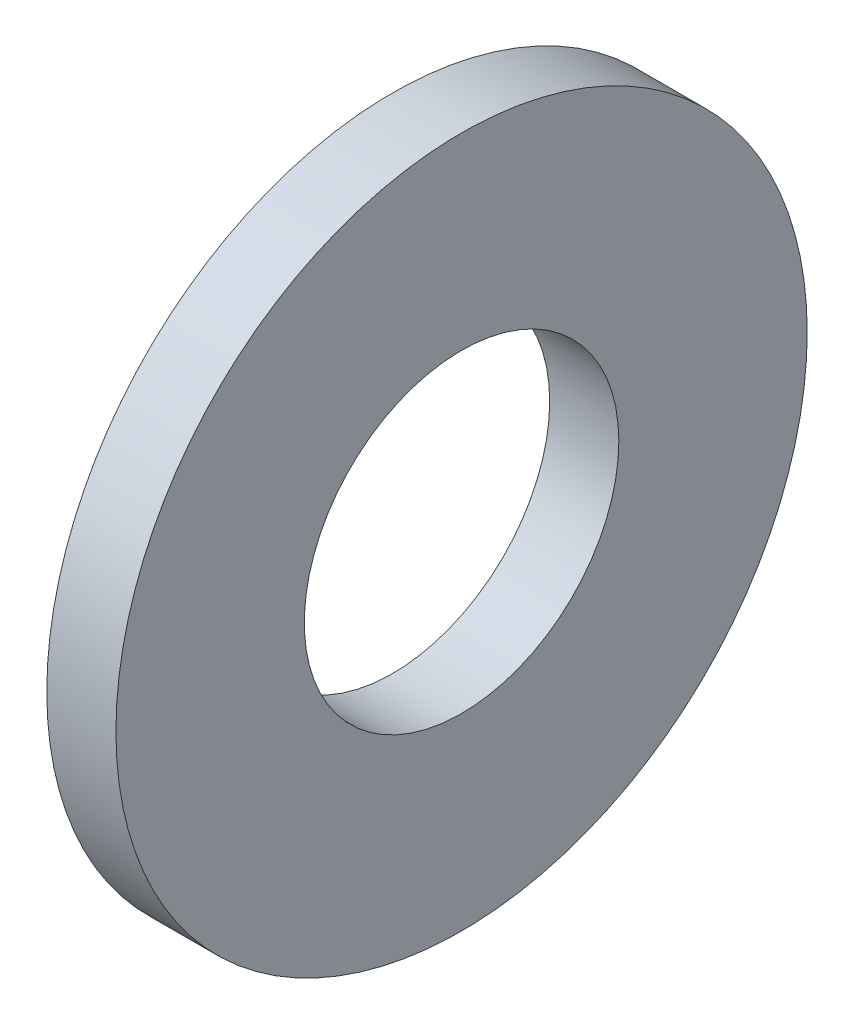
ISO-10303-21;
HEADER;
FILE_DESCRIPTION(('STEP AP214'),'2;1');
FILE_NAME('part.step','',(''),(''),'','','');
FILE_SCHEMA(('AUTOMOTIVE_DESIGN { 1 0 10303 214 1 1 1 1 }'));
ENDSEC;
DATA;
#1=APPLICATION_CONTEXT('core data for automotive mechanical design processes');
#2=APPLICATION_PROTOCOL_DEFINITION('international standard','automotive_design',2000,#1);
#3=PRODUCT_CONTEXT('',#1,'mechanical');
#4=PRODUCT('Part','Part','',(#3));
#5=PRODUCT_RELATED_PRODUCT_CATEGORY('part','',(#4));
#6=PRODUCT_DEFINITION_FORMATION('','',#4);
#7=PRODUCT_DEFINITION_CONTEXT('part definition',#1,'design');
#8=PRODUCT_DEFINITION('design','',#6,#7);
#9=PRODUCT_DEFINITION_SHAPE('','',#8);
#10=(LENGTH_UNIT() NAMED_UNIT(*) SI_UNIT(.MILLI.,.METRE.));
#11=(NAMED_UNIT(*) PLANE_ANGLE_UNIT() SI_UNIT($,.RADIAN.));
#12=(NAMED_UNIT(*) SI_UNIT($,.STERADIAN.) SOLID_ANGLE_UNIT());
#13=UNCERTAINTY_MEASURE_WITH_UNIT(LENGTH_MEASURE(1.E-05),#10,'distance_accuracy_value','');
#14=(GEOMETRIC_REPRESENTATION_CONTEXT(3) GLOBAL_UNCERTAINTY_ASSIGNED_CONTEXT((#13)) GLOBAL_UNIT_ASSIGNED_CONTEXT((#10,
#11,#12)) REPRESENTATION_CONTEXT('',''));
#15=CARTESIAN_POINT('',(0.,0.,0.));
#16=DIRECTION('',(0.,0.,1.));
#17=DIRECTION('',(1.,0.,0.));
#18=AXIS2_PLACEMENT_3D('',#15,#16,#17);
#19=CARTESIAN_POINT('',(1.,0.,0.));
#20=DIRECTION('',(1.,0.,0.));
#21=DIRECTION('',(0.,0.,-1.));
#22=AXIS2_PLACEMENT_3D('',#19,#20,#21);
#23=PLANE('',#22);
#24=CARTESIAN_POINT('',(1.,0.,0.));
#25=DIRECTION('',(1.,0.,0.));
#26=DIRECTION('',(0.,0.,-1.));
#27=AXIS2_PLACEMENT_3D('',#24,#25,#26);
#28=CIRCLE('',#27,5.);
#29=CARTESIAN_POINT('',(1.,0.,-5.));
#30=VERTEX_POINT('',#29);
#31=EDGE_CURVE('E10',#30,#30,#28,.T.);
#32=ORIENTED_EDGE('',*,*,#31,.T.);
#33=EDGE_LOOP('',(#32));
#34=FACE_BOUND('',#33,.T.);
#35=CARTESIAN_POINT('',(1.,0.,0.));
#36=DIRECTION('',(1.,0.,0.));
#37=DIRECTION('',(0.,0.,-1.));
#38=AXIS2_PLACEMENT_3D('',#35,#36,#37);
#39=CIRCLE('',#38,2.275);
#40=CARTESIAN_POINT('',(1.,0.,-2.275));
#41=VERTEX_POINT('',#40);
#42=EDGE_CURVE('E48',#41,#41,#39,.T.);
#43=ORIENTED_EDGE('',*,*,#42,.F.);
#44=EDGE_LOOP('',(#43));
#45=FACE_BOUND('',#44,.T.);
#46=ADVANCED_FACE('F37',(#34,#45),#23,.T.);
#47=CARTESIAN_POINT('',(0.,0.,0.));
#48=DIRECTION('',(1.,0.,0.));
#49=DIRECTION('',(0.,0.,-1.));
#50=AXIS2_PLACEMENT_3D('',#47,#48,#49);
#51=PLANE('',#50);
#52=CARTESIAN_POINT('',(0.,0.,0.));
#53=DIRECTION('',(1.,0.,0.));
#54=DIRECTION('',(0.,0.,-1.));
#55=AXIS2_PLACEMENT_3D('',#52,#53,#54);
#56=CIRCLE('',#55,5.);
#57=CARTESIAN_POINT('',(0.,0.,-5.));
#58=VERTEX_POINT('',#57);
#59=EDGE_CURVE('E41',#58,#58,#56,.T.);
#60=ORIENTED_EDGE('',*,*,#59,.F.);
#61=EDGE_LOOP('',(#60));
#62=FACE_BOUND('',#61,.T.);
#63=CARTESIAN_POINT('',(0.,0.,0.));
#64=DIRECTION('',(1.,0.,0.));
#65=DIRECTION('',(0.,0.,-1.));
#66=AXIS2_PLACEMENT_3D('',#63,#64,#65);
#67=CIRCLE('',#66,2.275);
#68=CARTESIAN_POINT('',(0.,0.,-2.275));
#69=VERTEX_POINT('',#68);
#70=EDGE_CURVE('E50',#69,#69,#67,.T.);
#71=ORIENTED_EDGE('',*,*,#70,.T.);
#72=EDGE_LOOP('',(#71));
#73=FACE_BOUND('',#72,.T.);
#74=ADVANCED_FACE('F60',(#62,#73),#51,.F.);
#75=CARTESIAN_POINT('',(1.,0.,0.));
#76=DIRECTION('',(-1.,0.,0.));
#77=DIRECTION('',(0.,0.,1.));
#78=AXIS2_PLACEMENT_3D('',#75,#76,#77);
#79=CYLINDRICAL_SURFACE('',#78,5.);
#80=ORIENTED_EDGE('',*,*,#31,.F.);
#81=EDGE_LOOP('',(#80));
#82=FACE_BOUND('',#81,.T.);
#83=ORIENTED_EDGE('',*,*,#59,.T.);
#84=EDGE_LOOP('',(#83));
#85=FACE_BOUND('',#84,.T.);
#86=ADVANCED_FACE('F39',(#82,#85),#79,.T.);
#87=CARTESIAN_POINT('',(1.,0.,0.));
#88=DIRECTION('',(-1.,0.,0.));
#89=DIRECTION('',(0.,0.,1.));
#90=AXIS2_PLACEMENT_3D('',#87,#88,#89);
#91=CYLINDRICAL_SURFACE('',#90,2.275);
#92=ORIENTED_EDGE('',*,*,#42,.T.);
#93=EDGE_LOOP('',(#92));
#94=FACE_BOUND('',#93,.T.);
#95=ORIENTED_EDGE('',*,*,#70,.F.);
#96=EDGE_LOOP('',(#95));
#97=FACE_BOUND('',#96,.T.);
#98=ADVANCED_FACE('F56',(#94,#97),#91,.F.);
#99=CLOSED_SHELL('',(#46,#74,#86,#98));
#100=MANIFOLD_SOLID_BREP('B2',#99);
#101=ADVANCED_BREP_SHAPE_REPRESENTATION('',(#18,#100),#14);
#102=SHAPE_DEFINITION_REPRESENTATION(#9,#101);
ENDSEC;
END-ISO-10303-21;
